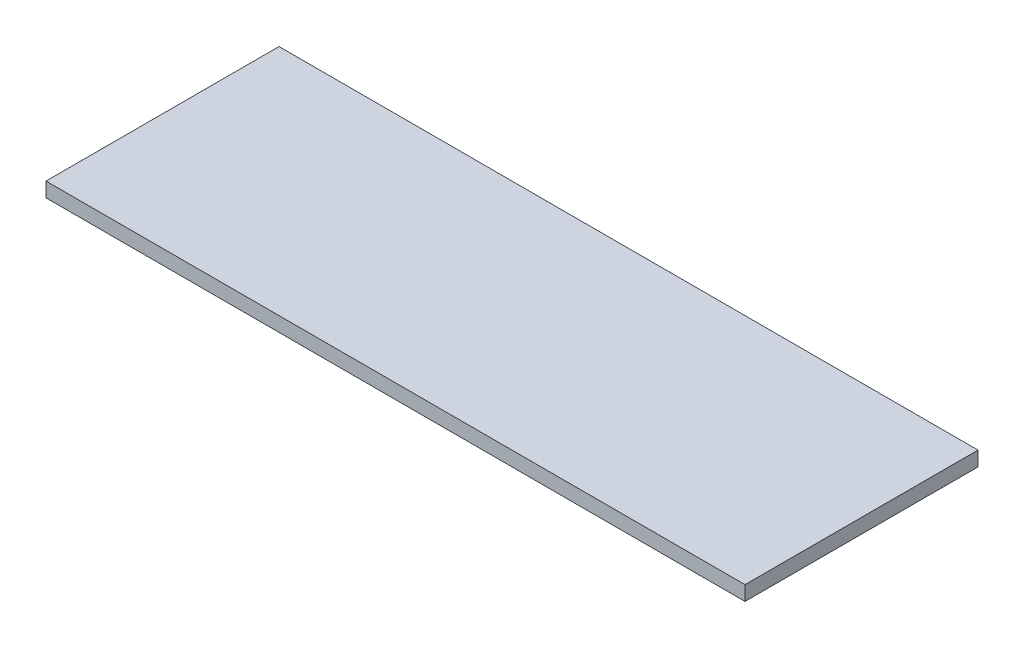
ISO-10303-21;
HEADER;
FILE_DESCRIPTION(('STEP AP214'),'2;1');
FILE_NAME('part.step','',(''),(''),'','','');
FILE_SCHEMA(('AUTOMOTIVE_DESIGN { 1 0 10303 214 1 1 1 1 }'));
ENDSEC;
DATA;
#1=APPLICATION_CONTEXT('core data for automotive mechanical design processes');
#2=APPLICATION_PROTOCOL_DEFINITION('international standard','automotive_design',2000,#1);
#3=PRODUCT_CONTEXT('',#1,'mechanical');
#4=PRODUCT('Part','Part','',(#3));
#5=PRODUCT_RELATED_PRODUCT_CATEGORY('part','',(#4));
#6=PRODUCT_DEFINITION_FORMATION('','',#4);
#7=PRODUCT_DEFINITION_CONTEXT('part definition',#1,'design');
#8=PRODUCT_DEFINITION('design','',#6,#7);
#9=PRODUCT_DEFINITION_SHAPE('','',#8);
#10=(LENGTH_UNIT() NAMED_UNIT(*) SI_UNIT(.MILLI.,.METRE.));
#11=(NAMED_UNIT(*) PLANE_ANGLE_UNIT() SI_UNIT($,.RADIAN.));
#12=(NAMED_UNIT(*) SI_UNIT($,.STERADIAN.) SOLID_ANGLE_UNIT());
#13=UNCERTAINTY_MEASURE_WITH_UNIT(LENGTH_MEASURE(1.E-05),#10,'distance_accuracy_value','');
#14=(GEOMETRIC_REPRESENTATION_CONTEXT(3) GLOBAL_UNCERTAINTY_ASSIGNED_CONTEXT((#13)) GLOBAL_UNIT_ASSIGNED_CONTEXT((#10,
#11,#12)) REPRESENTATION_CONTEXT('',''));
#15=CARTESIAN_POINT('',(0.,0.,0.));
#16=DIRECTION('',(0.,0.,1.));
#17=DIRECTION('',(1.,0.,0.));
#18=AXIS2_PLACEMENT_3D('',#15,#16,#17);
#19=CARTESIAN_POINT('',(-304.8,12.7,101.6));
#20=DIRECTION('',(1.,0.,0.));
#21=DIRECTION('',(0.,0.,-1.));
#22=AXIS2_PLACEMENT_3D('',#19,#20,#21);
#23=PLANE('',#22);
#24=DIRECTION('',(0.,0.,1.));
#25=VECTOR('',#24,1.);
#26=CARTESIAN_POINT('',(-304.8,0.,101.6));
#27=LINE('',#26,#25);
#28=CARTESIAN_POINT('',(-304.8,0.,-101.6));
#29=VERTEX_POINT('',#28);
#30=CARTESIAN_POINT('',(-304.8,0.,101.6));
#31=VERTEX_POINT('',#30);
#32=EDGE_CURVE('E95',#29,#31,#27,.T.);
#33=ORIENTED_EDGE('',*,*,#32,.T.);
#34=DIRECTION('',(0.,-1.,0.));
#35=VECTOR('',#34,1.);
#36=CARTESIAN_POINT('',(-304.8,12.7,101.6));
#37=LINE('',#36,#35);
#38=CARTESIAN_POINT('',(-304.8,12.7,101.6));
#39=VERTEX_POINT('',#38);
#40=EDGE_CURVE('E11',#39,#31,#37,.T.);
#41=ORIENTED_EDGE('',*,*,#40,.F.);
#42=DIRECTION('',(0.,0.,1.));
#43=VECTOR('',#42,1.);
#44=CARTESIAN_POINT('',(-304.8,12.7,101.6));
#45=LINE('',#44,#43);
#46=CARTESIAN_POINT('',(-304.8,12.7,-101.6));
#47=VERTEX_POINT('',#46);
#48=EDGE_CURVE('E83',#47,#39,#45,.T.);
#49=ORIENTED_EDGE('',*,*,#48,.F.);
#50=DIRECTION('',(0.,-1.,0.));
#51=VECTOR('',#50,1.);
#52=CARTESIAN_POINT('',(-304.8,12.7,-101.6));
#53=LINE('',#52,#51);
#54=EDGE_CURVE('E91',#47,#29,#53,.T.);
#55=ORIENTED_EDGE('',*,*,#54,.T.);
#56=EDGE_LOOP('',(#33,#41,#49,#55));
#57=FACE_BOUND('',#56,.T.);
#58=ADVANCED_FACE('F32',(#57),#23,.F.);
#59=CARTESIAN_POINT('',(304.8,12.7,101.6));
#60=DIRECTION('',(0.,0.,-1.));
#61=DIRECTION('',(-1.,0.,0.));
#62=AXIS2_PLACEMENT_3D('',#59,#60,#61);
#63=PLANE('',#62);
#64=DIRECTION('',(1.,0.,0.));
#65=VECTOR('',#64,1.);
#66=CARTESIAN_POINT('',(304.8,0.,101.6));
#67=LINE('',#66,#65);
#68=CARTESIAN_POINT('',(304.8,0.,101.6));
#69=VERTEX_POINT('',#68);
#70=EDGE_CURVE('E87',#31,#69,#67,.T.);
#71=ORIENTED_EDGE('',*,*,#70,.T.);
#72=DIRECTION('',(0.,-1.,0.));
#73=VECTOR('',#72,1.);
#74=CARTESIAN_POINT('',(304.8,12.7,101.6));
#75=LINE('',#74,#73);
#76=CARTESIAN_POINT('',(304.8,12.7,101.6));
#77=VERTEX_POINT('',#76);
#78=EDGE_CURVE('E40',#77,#69,#75,.T.);
#79=ORIENTED_EDGE('',*,*,#78,.F.);
#80=DIRECTION('',(1.,0.,0.));
#81=VECTOR('',#80,1.);
#82=CARTESIAN_POINT('',(304.8,12.7,101.6));
#83=LINE('',#82,#81);
#84=EDGE_CURVE('E78',#39,#77,#83,.T.);
#85=ORIENTED_EDGE('',*,*,#84,.F.);
#86=ORIENTED_EDGE('',*,*,#40,.T.);
#87=EDGE_LOOP('',(#71,#79,#85,#86));
#88=FACE_BOUND('',#87,.T.);
#89=ADVANCED_FACE('F86',(#88),#63,.F.);
#90=CARTESIAN_POINT('',(304.8,12.7,101.6));
#91=DIRECTION('',(-1.,0.,0.));
#92=DIRECTION('',(0.,0.,1.));
#93=AXIS2_PLACEMENT_3D('',#90,#91,#92);
#94=PLANE('',#93);
#95=DIRECTION('',(0.,0.,-1.));
#96=VECTOR('',#95,1.);
#97=CARTESIAN_POINT('',(304.8,0.,101.6));
#98=LINE('',#97,#96);
#99=CARTESIAN_POINT('',(304.8,0.,-101.6));
#100=VERTEX_POINT('',#99);
#101=EDGE_CURVE('E65',#69,#100,#98,.T.);
#102=ORIENTED_EDGE('',*,*,#101,.T.);
#103=DIRECTION('',(0.,-1.,0.));
#104=VECTOR('',#103,1.);
#105=CARTESIAN_POINT('',(304.8,12.7,-101.6));
#106=LINE('',#105,#104);
#107=CARTESIAN_POINT('',(304.8,12.7,-101.6));
#108=VERTEX_POINT('',#107);
#109=EDGE_CURVE('E88',#108,#100,#106,.T.);
#110=ORIENTED_EDGE('',*,*,#109,.F.);
#111=DIRECTION('',(0.,0.,-1.));
#112=VECTOR('',#111,1.);
#113=CARTESIAN_POINT('',(304.8,12.7,101.6));
#114=LINE('',#113,#112);
#115=EDGE_CURVE('E81',#77,#108,#114,.T.);
#116=ORIENTED_EDGE('',*,*,#115,.F.);
#117=ORIENTED_EDGE('',*,*,#78,.T.);
#118=EDGE_LOOP('',(#102,#110,#116,#117));
#119=FACE_BOUND('',#118,.T.);
#120=ADVANCED_FACE('F89',(#119),#94,.F.);
#121=CARTESIAN_POINT('',(304.8,12.7,-101.6));
#122=DIRECTION('',(0.,0.,1.));
#123=DIRECTION('',(1.,0.,0.));
#124=AXIS2_PLACEMENT_3D('',#121,#122,#123);
#125=PLANE('',#124);
#126=DIRECTION('',(-1.,0.,0.));
#127=VECTOR('',#126,1.);
#128=CARTESIAN_POINT('',(304.8,0.,-101.6));
#129=LINE('',#128,#127);
#130=EDGE_CURVE('E71',#100,#29,#129,.T.);
#131=ORIENTED_EDGE('',*,*,#130,.T.);
#132=ORIENTED_EDGE('',*,*,#54,.F.);
#133=DIRECTION('',(-1.,0.,0.));
#134=VECTOR('',#133,1.);
#135=CARTESIAN_POINT('',(304.8,12.7,-101.6));
#136=LINE('',#135,#134);
#137=EDGE_CURVE('E48',#108,#47,#136,.T.);
#138=ORIENTED_EDGE('',*,*,#137,.F.);
#139=ORIENTED_EDGE('',*,*,#109,.T.);
#140=EDGE_LOOP('',(#131,#132,#138,#139));
#141=FACE_BOUND('',#140,.T.);
#142=ADVANCED_FACE('F102',(#141),#125,.F.);
#143=CARTESIAN_POINT('',(0.,12.7,0.));
#144=DIRECTION('',(0.,1.,0.));
#145=DIRECTION('',(0.,0.,1.));
#146=AXIS2_PLACEMENT_3D('',#143,#144,#145);
#147=PLANE('',#146);
#148=ORIENTED_EDGE('',*,*,#48,.T.);
#149=ORIENTED_EDGE('',*,*,#84,.T.);
#150=ORIENTED_EDGE('',*,*,#115,.T.);
#151=ORIENTED_EDGE('',*,*,#137,.T.);
#152=EDGE_LOOP('',(#148,#149,#150,#151));
#153=FACE_BOUND('',#152,.T.);
#154=ADVANCED_FACE('F79',(#153),#147,.T.);
#155=CARTESIAN_POINT('',(0.,0.,0.));
#156=DIRECTION('',(0.,1.,0.));
#157=DIRECTION('',(0.,0.,1.));
#158=AXIS2_PLACEMENT_3D('',#155,#156,#157);
#159=PLANE('',#158);
#160=ORIENTED_EDGE('',*,*,#32,.F.);
#161=ORIENTED_EDGE('',*,*,#130,.F.);
#162=ORIENTED_EDGE('',*,*,#101,.F.);
#163=ORIENTED_EDGE('',*,*,#70,.F.);
#164=EDGE_LOOP('',(#160,#161,#162,#163));
#165=FACE_BOUND('',#164,.T.);
#166=ADVANCED_FACE('F105',(#165),#159,.F.);
#167=CLOSED_SHELL('',(#58,#89,#120,#142,#154,#166));
#168=MANIFOLD_SOLID_BREP('B2',#167);
#169=ADVANCED_BREP_SHAPE_REPRESENTATION('',(#18,#168),#14);
#170=SHAPE_DEFINITION_REPRESENTATION(#9,#169);
ENDSEC;
END-ISO-10303-21;
